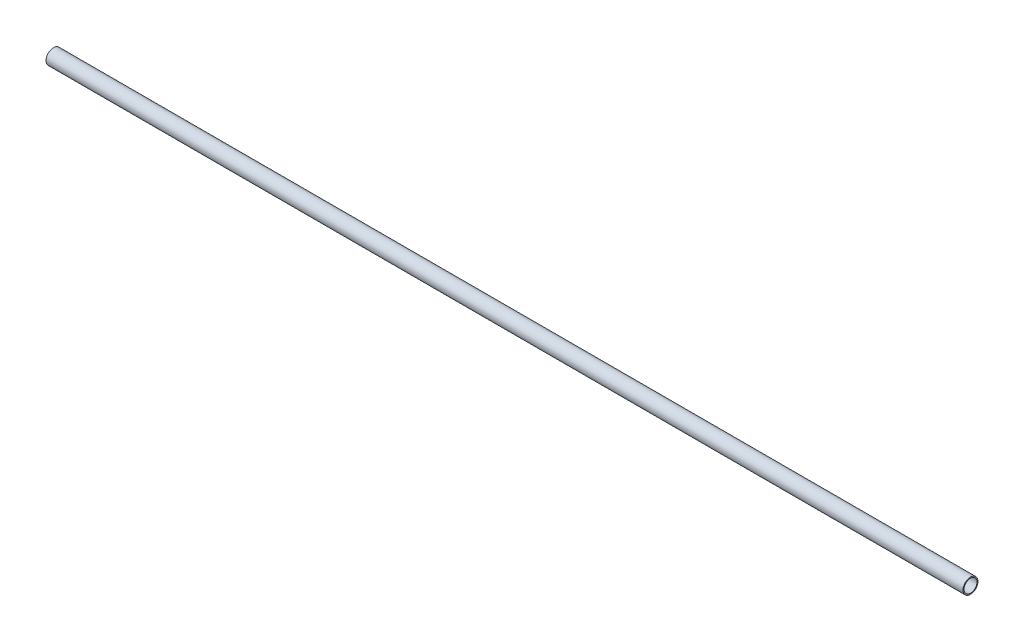
ISO-10303-21;
HEADER;
FILE_DESCRIPTION(('STEP AP214'),'2;1');
FILE_NAME('part.step','',(''),(''),'','','');
FILE_SCHEMA(('AUTOMOTIVE_DESIGN { 1 0 10303 214 1 1 1 1 }'));
ENDSEC;
DATA;
#1=APPLICATION_CONTEXT('core data for automotive mechanical design processes');
#2=APPLICATION_PROTOCOL_DEFINITION('international standard','automotive_design',2000,#1);
#3=PRODUCT_CONTEXT('',#1,'mechanical');
#4=PRODUCT('Part','Part','',(#3));
#5=PRODUCT_RELATED_PRODUCT_CATEGORY('part','',(#4));
#6=PRODUCT_DEFINITION_FORMATION('','',#4);
#7=PRODUCT_DEFINITION_CONTEXT('part definition',#1,'design');
#8=PRODUCT_DEFINITION('design','',#6,#7);
#9=PRODUCT_DEFINITION_SHAPE('','',#8);
#10=(LENGTH_UNIT() NAMED_UNIT(*) SI_UNIT(.MILLI.,.METRE.));
#11=(NAMED_UNIT(*) PLANE_ANGLE_UNIT() SI_UNIT($,.RADIAN.));
#12=(NAMED_UNIT(*) SI_UNIT($,.STERADIAN.) SOLID_ANGLE_UNIT());
#13=UNCERTAINTY_MEASURE_WITH_UNIT(LENGTH_MEASURE(1.E-05),#10,'distance_accuracy_value','');
#14=(GEOMETRIC_REPRESENTATION_CONTEXT(3) GLOBAL_UNCERTAINTY_ASSIGNED_CONTEXT((#13)) GLOBAL_UNIT_ASSIGNED_CONTEXT((#10,
#11,#12)) REPRESENTATION_CONTEXT('',''));
#15=CARTESIAN_POINT('',(0.,0.,0.));
#16=DIRECTION('',(0.,0.,1.));
#17=DIRECTION('',(1.,0.,0.));
#18=AXIS2_PLACEMENT_3D('',#15,#16,#17);
#19=CARTESIAN_POINT('',(90.,0.,0.));
#20=DIRECTION('',(1.,0.,0.));
#21=DIRECTION('',(0.,0.,-1.));
#22=AXIS2_PLACEMENT_3D('',#19,#20,#21);
#23=PLANE('',#22);
#24=CARTESIAN_POINT('',(90.,0.,0.));
#25=DIRECTION('',(1.,0.,0.));
#26=DIRECTION('',(0.,0.,-1.));
#27=AXIS2_PLACEMENT_3D('',#24,#25,#26);
#28=CIRCLE('',#27,0.7366);
#29=CARTESIAN_POINT('',(90.,0.,0.7366));
#30=VERTEX_POINT('',#29);
#31=EDGE_CURVE('E10',#30,#30,#28,.T.);
#32=ORIENTED_EDGE('',*,*,#31,.T.);
#33=EDGE_LOOP('',(#32));
#34=FACE_BOUND('',#33,.T.);
#35=CARTESIAN_POINT('',(90.,0.,0.));
#36=DIRECTION('',(1.,0.,0.));
#37=DIRECTION('',(0.,0.,-1.));
#38=AXIS2_PLACEMENT_3D('',#35,#36,#37);
#39=CIRCLE('',#38,0.635);
#40=CARTESIAN_POINT('',(90.,0.,-0.635));
#41=VERTEX_POINT('',#40);
#42=EDGE_CURVE('E42',#41,#41,#39,.T.);
#43=ORIENTED_EDGE('',*,*,#42,.F.);
#44=EDGE_LOOP('',(#43));
#45=FACE_BOUND('',#44,.T.);
#46=ADVANCED_FACE('F31',(#34,#45),#23,.T.);
#47=CARTESIAN_POINT('',(0.,0.,0.));
#48=DIRECTION('',(1.,0.,0.));
#49=DIRECTION('',(0.,0.,-1.));
#50=AXIS2_PLACEMENT_3D('',#47,#48,#49);
#51=PLANE('',#50);
#52=CARTESIAN_POINT('',(0.,0.,0.));
#53=DIRECTION('',(1.,0.,0.));
#54=DIRECTION('',(0.,0.,-1.));
#55=AXIS2_PLACEMENT_3D('',#52,#53,#54);
#56=CIRCLE('',#55,0.7366);
#57=CARTESIAN_POINT('',(0.,0.,0.7366));
#58=VERTEX_POINT('',#57);
#59=EDGE_CURVE('E35',#58,#58,#56,.T.);
#60=ORIENTED_EDGE('',*,*,#59,.F.);
#61=EDGE_LOOP('',(#60));
#62=FACE_BOUND('',#61,.T.);
#63=CARTESIAN_POINT('',(0.,0.,0.));
#64=DIRECTION('',(1.,0.,0.));
#65=DIRECTION('',(0.,0.,-1.));
#66=AXIS2_PLACEMENT_3D('',#63,#64,#65);
#67=CIRCLE('',#66,0.635);
#68=CARTESIAN_POINT('',(0.,0.,-0.635));
#69=VERTEX_POINT('',#68);
#70=EDGE_CURVE('E44',#69,#69,#67,.T.);
#71=ORIENTED_EDGE('',*,*,#70,.T.);
#72=EDGE_LOOP('',(#71));
#73=FACE_BOUND('',#72,.T.);
#74=ADVANCED_FACE('F54',(#62,#73),#51,.F.);
#75=CARTESIAN_POINT('',(90.,0.,0.));
#76=DIRECTION('',(-1.,0.,0.));
#77=DIRECTION('',(0.,0.,1.));
#78=AXIS2_PLACEMENT_3D('',#75,#76,#77);
#79=CYLINDRICAL_SURFACE('',#78,0.7366);
#80=CARTESIAN_POINT('',(90.,0.,0.7366));
#81=CARTESIAN_POINT('',(89.0625,0.,0.7366));
#82=CARTESIAN_POINT('',(88.125,0.,0.7366));
#83=CARTESIAN_POINT('',(86.25,0.,0.7366));
#84=CARTESIAN_POINT('',(85.3125,0.,0.7366));
#85=CARTESIAN_POINT('',(83.4375,0.,0.7366));
#86=CARTESIAN_POINT('',(82.5,0.,0.7366));
#87=CARTESIAN_POINT('',(80.625,0.,0.7366));
#88=CARTESIAN_POINT('',(79.6875,0.,0.7366));
#89=CARTESIAN_POINT('',(77.8125,0.,0.7366));
#90=CARTESIAN_POINT('',(76.875,0.,0.7366));
#91=CARTESIAN_POINT('',(75.,0.,0.7366));
#92=CARTESIAN_POINT('',(74.0625,0.,0.7366));
#93=CARTESIAN_POINT('',(72.1875,0.,0.7366));
#94=CARTESIAN_POINT('',(71.25,0.,0.7366));
#95=CARTESIAN_POINT('',(69.375,0.,0.7366));
#96=CARTESIAN_POINT('',(68.4375,0.,0.7366));
#97=CARTESIAN_POINT('',(66.5625,0.,0.7366));
#98=CARTESIAN_POINT('',(65.625,0.,0.7366));
#99=CARTESIAN_POINT('',(63.75,0.,0.7366));
#100=CARTESIAN_POINT('',(62.8125,0.,0.7366));
#101=CARTESIAN_POINT('',(60.9375,0.,0.7366));
#102=CARTESIAN_POINT('',(60.,0.,0.7366));
#103=CARTESIAN_POINT('',(58.125,0.,0.7366));
#104=CARTESIAN_POINT('',(57.1875,0.,0.7366));
#105=CARTESIAN_POINT('',(55.3125,0.,0.7366));
#106=CARTESIAN_POINT('',(54.375,0.,0.7366));
#107=CARTESIAN_POINT('',(52.5,0.,0.7366));
#108=CARTESIAN_POINT('',(51.5625,0.,0.7366));
#109=CARTESIAN_POINT('',(49.6875,0.,0.7366));
#110=CARTESIAN_POINT('',(48.75,0.,0.7366));
#111=CARTESIAN_POINT('',(46.875,0.,0.7366));
#112=CARTESIAN_POINT('',(45.9375,0.,0.7366));
#113=CARTESIAN_POINT('',(44.0625,0.,0.7366));
#114=CARTESIAN_POINT('',(43.125,0.,0.7366));
#115=CARTESIAN_POINT('',(41.25,0.,0.7366));
#116=CARTESIAN_POINT('',(40.3125,0.,0.7366));
#117=CARTESIAN_POINT('',(38.4375,0.,0.7366));
#118=CARTESIAN_POINT('',(37.5,0.,0.7366));
#119=CARTESIAN_POINT('',(35.625,0.,0.7366));
#120=CARTESIAN_POINT('',(34.6875,0.,0.7366));
#121=CARTESIAN_POINT('',(32.8125,0.,0.7366));
#122=CARTESIAN_POINT('',(31.875,0.,0.7366));
#123=CARTESIAN_POINT('',(30.,0.,0.7366));
#124=CARTESIAN_POINT('',(29.0625,0.,0.7366));
#125=CARTESIAN_POINT('',(27.1875,0.,0.7366));
#126=CARTESIAN_POINT('',(26.25,0.,0.7366));
#127=CARTESIAN_POINT('',(24.375,0.,0.7366));
#128=CARTESIAN_POINT('',(23.4375,0.,0.7366));
#129=CARTESIAN_POINT('',(21.5625,0.,0.7366));
#130=CARTESIAN_POINT('',(20.625,0.,0.7366));
#131=CARTESIAN_POINT('',(18.75,0.,0.7366));
#132=CARTESIAN_POINT('',(17.8125,0.,0.7366));
#133=CARTESIAN_POINT('',(15.9375,0.,0.7366));
#134=CARTESIAN_POINT('',(15.,0.,0.7366));
#135=CARTESIAN_POINT('',(13.125,0.,0.7366));
#136=CARTESIAN_POINT('',(12.1875,0.,0.7366));
#137=CARTESIAN_POINT('',(10.3125,0.,0.7366));
#138=CARTESIAN_POINT('',(9.37499999999999,0.,0.7366));
#139=CARTESIAN_POINT('',(7.49999999999999,0.,0.7366));
#140=CARTESIAN_POINT('',(6.56249999999999,0.,0.7366));
#141=CARTESIAN_POINT('',(4.68749999999999,0.,0.7366));
#142=CARTESIAN_POINT('',(3.74999999999998,0.,0.7366));
#143=CARTESIAN_POINT('',(1.87499999999998,0.,0.7366));
#144=CARTESIAN_POINT('',(0.937499999999986,0.,0.7366));
#145=CARTESIAN_POINT('',(0.,0.,0.7366));
#146=B_SPLINE_CURVE_WITH_KNOTS('',3,(#80,#81,#82,#83,#84,#85,#86,#87,#88,#89,#90,#91,#92,#93,
#94,#95,#96,#97,#98,#99,#100,#101,#102,#103,#104,#105,#106,#107,#108,#109,#110,#111,#112,#113,
#114,#115,#116,#117,#118,#119,#120,#121,#122,#123,#124,#125,#126,#127,#128,#129,#130,#131,#132,
#133,#134,#135,#136,#137,#138,#139,#140,#141,#142,#143,#144,#145),.UNSPECIFIED.,.F.,.F.,(4,2,2,
2,2,2,2,2,2,2,2,2,2,2,2,2,2,2,2,2,2,2,2,2,2,2,2,2,2,2,2,2,4),(0.,2.8125,5.62499999999999,
8.43749999999999,11.25,14.0625,16.875,19.6875,22.5,25.3125,28.125,30.9375,33.75,36.5625,39.375,
42.1875,45.,47.8125,50.625,53.4375,56.25,59.0625,61.875,64.6875,67.5,70.3125,73.125,75.9375,
78.75,81.5625,84.375,87.1875,90.),.UNSPECIFIED.);
#147=EDGE_CURVE('BSEAM33',#30,#58,#146,.T.);
#148=ORIENTED_EDGE('',*,*,#31,.F.);
#149=ORIENTED_EDGE('',*,*,#59,.T.);
#150=ORIENTED_EDGE('',*,*,#147,.T.);
#151=ORIENTED_EDGE('',*,*,#147,.F.);
#152=EDGE_LOOP('',(#148,#150,#149,#151));
#153=FACE_BOUND('',#152,.T.);
#154=ADVANCED_FACE('F33',(#153),#79,.T.);
#155=CARTESIAN_POINT('',(90.,0.,0.));
#156=DIRECTION('',(-1.,0.,0.));
#157=DIRECTION('',(0.,0.,1.));
#158=AXIS2_PLACEMENT_3D('',#155,#156,#157);
#159=CYLINDRICAL_SURFACE('',#158,0.635);
#160=ORIENTED_EDGE('',*,*,#42,.T.);
#161=EDGE_LOOP('',(#160));
#162=FACE_BOUND('',#161,.T.);
#163=ORIENTED_EDGE('',*,*,#70,.F.);
#164=EDGE_LOOP('',(#163));
#165=FACE_BOUND('',#164,.T.);
#166=ADVANCED_FACE('F50',(#162,#165),#159,.F.);
#167=CLOSED_SHELL('',(#46,#74,#154,#166));
#168=MANIFOLD_SOLID_BREP('B2',#167);
#169=ADVANCED_BREP_SHAPE_REPRESENTATION('',(#18,#168),#14);
#170=SHAPE_DEFINITION_REPRESENTATION(#9,#169);
ENDSEC;
END-ISO-10303-21;
